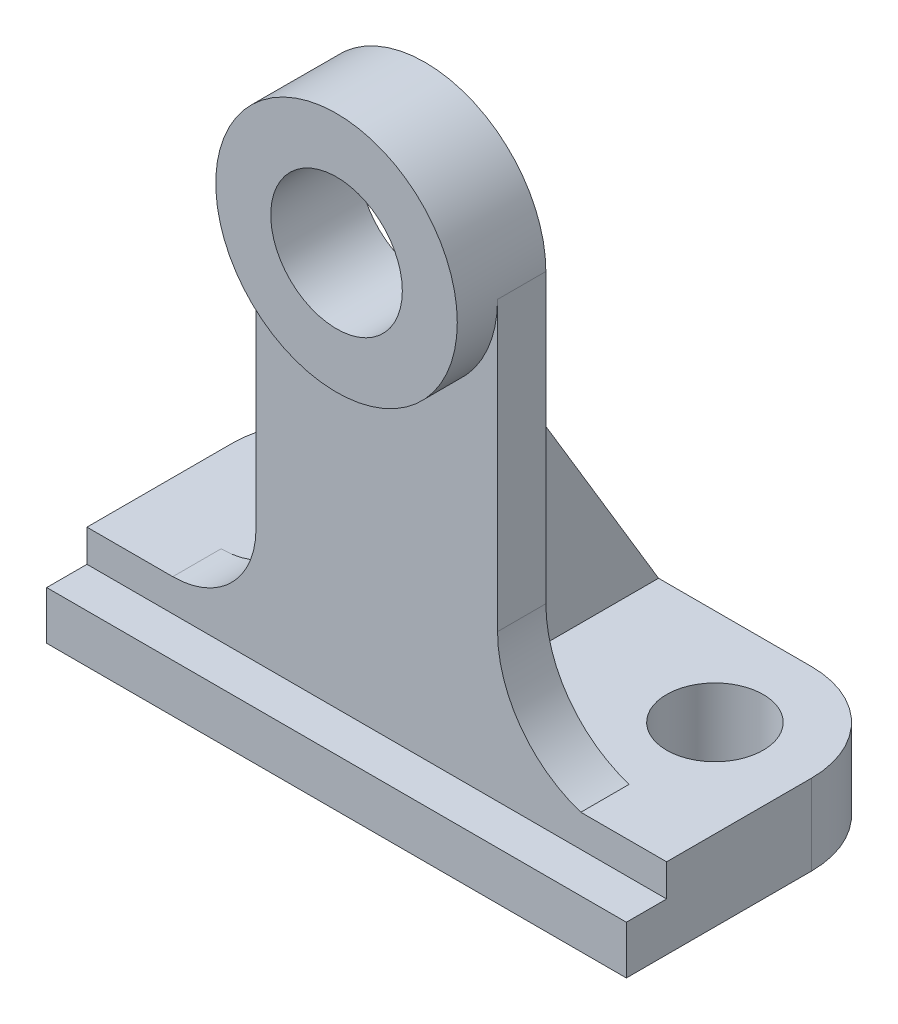
ISO-10303-21;
HEADER;
FILE_DESCRIPTION(('STEP AP214'),'2;1');
FILE_NAME('part.step','',(''),(''),'','','');
FILE_SCHEMA(('AUTOMOTIVE_DESIGN { 1 0 10303 214 1 1 1 1 }'));
ENDSEC;
DATA;
#1=APPLICATION_CONTEXT('core data for automotive mechanical design processes');
#2=APPLICATION_PROTOCOL_DEFINITION('international standard','automotive_design',2000,#1);
#3=PRODUCT_CONTEXT('',#1,'mechanical');
#4=PRODUCT('Part','Part','',(#3));
#5=PRODUCT_RELATED_PRODUCT_CATEGORY('part','',(#4));
#6=PRODUCT_DEFINITION_FORMATION('','',#4);
#7=PRODUCT_DEFINITION_CONTEXT('part definition',#1,'design');
#8=PRODUCT_DEFINITION('design','',#6,#7);
#9=PRODUCT_DEFINITION_SHAPE('','',#8);
#10=(LENGTH_UNIT() NAMED_UNIT(*) SI_UNIT(.MILLI.,.METRE.));
#11=(NAMED_UNIT(*) PLANE_ANGLE_UNIT() SI_UNIT($,.RADIAN.));
#12=(NAMED_UNIT(*) SI_UNIT($,.STERADIAN.) SOLID_ANGLE_UNIT());
#13=UNCERTAINTY_MEASURE_WITH_UNIT(LENGTH_MEASURE(1.E-05),#10,'distance_accuracy_value','');
#14=(GEOMETRIC_REPRESENTATION_CONTEXT(3) GLOBAL_UNCERTAINTY_ASSIGNED_CONTEXT((#13)) GLOBAL_UNIT_ASSIGNED_CONTEXT((#10,
#11,#12)) REPRESENTATION_CONTEXT('',''));
#15=CARTESIAN_POINT('',(0.,0.,0.));
#16=DIRECTION('',(0.,0.,1.));
#17=DIRECTION('',(1.,0.,0.));
#18=AXIS2_PLACEMENT_3D('',#15,#16,#17);
#19=CARTESIAN_POINT('',(72.,10.,12.5));
#20=DIRECTION('',(0.,-1.,0.));
#21=DIRECTION('',(0.,0.,-1.));
#22=AXIS2_PLACEMENT_3D('',#19,#20,#21);
#23=PLANE('',#22);
#24=CARTESIAN_POINT('',(12.,10.,-5.5));
#25=DIRECTION('',(0.,1.,0.));
#26=DIRECTION('',(0.,0.,1.));
#27=AXIS2_PLACEMENT_3D('',#24,#25,#26);
#28=CIRCLE('',#27,6.);
#29=CARTESIAN_POINT('',(12.,10.,0.5));
#30=VERTEX_POINT('',#29);
#31=EDGE_CURVE('E403',#30,#30,#28,.T.);
#32=ORIENTED_EDGE('',*,*,#31,.F.);
#33=EDGE_LOOP('',(#32));
#34=FACE_BOUND('',#33,.T.);
#35=DIRECTION('',(-1.,0.,0.));
#36=VECTOR('',#35,1.);
#37=CARTESIAN_POINT('',(72.,10.,-17.5));
#38=LINE('',#37,#36);
#39=CARTESIAN_POINT('',(31.,9.99999999999999,-17.5));
#40=VERTEX_POINT('',#39);
#41=CARTESIAN_POINT('',(12.,10.,-17.5));
#42=VERTEX_POINT('',#41);
#43=EDGE_CURVE('E321',#40,#42,#38,.T.);
#44=ORIENTED_EDGE('',*,*,#43,.T.);
#45=CARTESIAN_POINT('',(12.,10.,-5.5));
#46=DIRECTION('',(0.,-1.,0.));
#47=DIRECTION('',(0.,0.,-1.));
#48=AXIS2_PLACEMENT_3D('',#45,#46,#47);
#49=CIRCLE('',#48,12.);
#50=CARTESIAN_POINT('',(0.,10.,-5.49999999999999));
#51=VERTEX_POINT('',#50);
#52=EDGE_CURVE('E54',#42,#51,#49,.F.);
#53=ORIENTED_EDGE('',*,*,#52,.T.);
#54=DIRECTION('',(0.,0.,1.));
#55=VECTOR('',#54,1.);
#56=CARTESIAN_POINT('',(0.,10.,12.5));
#57=LINE('',#56,#55);
#58=CARTESIAN_POINT('',(0.,10.,12.5));
#59=VERTEX_POINT('',#58);
#60=EDGE_CURVE('E294',#51,#59,#57,.T.);
#61=ORIENTED_EDGE('',*,*,#60,.T.);
#62=DIRECTION('',(-1.,0.,0.));
#63=VECTOR('',#62,1.);
#64=CARTESIAN_POINT('',(72.,10.,12.5));
#65=LINE('',#64,#63);
#66=CARTESIAN_POINT('',(10.659246626504,10.,12.5));
#67=VERTEX_POINT('',#66);
#68=EDGE_CURVE('E316',#67,#59,#65,.T.);
#69=ORIENTED_EDGE('',*,*,#68,.F.);
#70=DIRECTION('',(0.,0.,1.));
#71=VECTOR('',#70,1.);
#72=CARTESIAN_POINT('',(10.659246626504,10.,6.5));
#73=LINE('',#72,#71);
#74=CARTESIAN_POINT('',(10.659246626504,10.,6.5));
#75=VERTEX_POINT('',#74);
#76=EDGE_CURVE('E257',#75,#67,#73,.T.);
#77=ORIENTED_EDGE('',*,*,#76,.F.);
#78=DIRECTION('',(1.,0.,0.));
#79=VECTOR('',#78,1.);
#80=CARTESIAN_POINT('',(10.659246626504,10.,6.5));
#81=LINE('',#80,#79);
#82=CARTESIAN_POINT('',(31.,10.,6.5));
#83=VERTEX_POINT('',#82);
#84=EDGE_CURVE('E228',#75,#83,#81,.T.);
#85=ORIENTED_EDGE('',*,*,#84,.T.);
#86=DIRECTION('',(0.,0.,1.));
#87=VECTOR('',#86,1.);
#88=CARTESIAN_POINT('',(31.,10.,12.5));
#89=LINE('',#88,#87);
#90=EDGE_CURVE('E168',#40,#83,#89,.T.);
#91=ORIENTED_EDGE('',*,*,#90,.F.);
#92=EDGE_LOOP('',(#44,#53,#61,#69,#77,#85,#91));
#93=FACE_BOUND('',#92,.T.);
#94=ADVANCED_FACE('F45',(#34,#93),#23,.F.);
#95=CARTESIAN_POINT('',(72.,6.,12.5));
#96=DIRECTION('',(0.,0.,-1.));
#97=DIRECTION('',(-1.,0.,0.));
#98=AXIS2_PLACEMENT_3D('',#95,#96,#97);
#99=PLANE('',#98);
#100=DIRECTION('',(0.,-1.,0.));
#101=VECTOR('',#100,1.);
#102=CARTESIAN_POINT('',(51.,60.,12.5));
#103=LINE('',#102,#101);
#104=CARTESIAN_POINT('',(51.,60.,12.5));
#105=VERTEX_POINT('',#104);
#106=CARTESIAN_POINT('',(51.,24.2580300488325,12.5));
#107=VERTEX_POINT('',#106);
#108=EDGE_CURVE('E214',#105,#107,#103,.T.);
#109=ORIENTED_EDGE('',*,*,#108,.F.);
#110=CARTESIAN_POINT('',(36.,60.,12.5));
#111=DIRECTION('',(0.,0.,1.));
#112=DIRECTION('',(1.,0.,0.));
#113=AXIS2_PLACEMENT_3D('',#110,#111,#112);
#114=CIRCLE('',#113,15.);
#115=CARTESIAN_POINT('',(21.,60.,12.5));
#116=VERTEX_POINT('',#115);
#117=EDGE_CURVE('E203',#116,#105,#114,.T.);
#118=ORIENTED_EDGE('',*,*,#117,.F.);
#119=DIRECTION('',(0.,-1.,0.));
#120=VECTOR('',#119,1.);
#121=CARTESIAN_POINT('',(21.,60.,12.5));
#122=LINE('',#121,#120);
#123=CARTESIAN_POINT('',(21.,20.340753373496,12.5));
#124=VERTEX_POINT('',#123);
#125=EDGE_CURVE('E220',#116,#124,#122,.T.);
#126=ORIENTED_EDGE('',*,*,#125,.T.);
#127=CARTESIAN_POINT('',(10.659246626504,20.340753373496,12.5));
#128=DIRECTION('',(0.,0.,-1.));
#129=DIRECTION('',(-1.,0.,0.));
#130=AXIS2_PLACEMENT_3D('',#127,#128,#129);
#131=CIRCLE('',#130,10.340753373496);
#132=EDGE_CURVE('E245',#124,#67,#131,.T.);
#133=ORIENTED_EDGE('',*,*,#132,.T.);
#134=ORIENTED_EDGE('',*,*,#68,.T.);
#135=DIRECTION('',(0.,-1.,0.));
#136=VECTOR('',#135,1.);
#137=CARTESIAN_POINT('',(0.,6.,12.5));
#138=LINE('',#137,#136);
#139=CARTESIAN_POINT('',(0.,6.,12.5));
#140=VERTEX_POINT('',#139);
#141=EDGE_CURVE('E297',#59,#140,#138,.T.);
#142=ORIENTED_EDGE('',*,*,#141,.T.);
#143=DIRECTION('',(-1.,0.,0.));
#144=VECTOR('',#143,1.);
#145=CARTESIAN_POINT('',(72.,6.,12.5));
#146=LINE('',#145,#144);
#147=CARTESIAN_POINT('',(72.,6.,12.5));
#148=VERTEX_POINT('',#147);
#149=EDGE_CURVE('E313',#148,#140,#146,.T.);
#150=ORIENTED_EDGE('',*,*,#149,.F.);
#151=DIRECTION('',(0.,-1.,0.));
#152=VECTOR('',#151,1.);
#153=CARTESIAN_POINT('',(72.,6.,12.5));
#154=LINE('',#153,#152);
#155=CARTESIAN_POINT('',(72.,10.,12.5));
#156=VERTEX_POINT('',#155);
#157=EDGE_CURVE('E282',#156,#148,#154,.T.);
#158=ORIENTED_EDGE('',*,*,#157,.F.);
#159=CARTESIAN_POINT('',(61.340753373496,10.,12.5));
#160=VERTEX_POINT('',#159);
#161=EDGE_CURVE('E317',#156,#160,#65,.T.);
#162=ORIENTED_EDGE('',*,*,#161,.T.);
#163=CARTESIAN_POINT('',(66.,24.2580300488325,12.5));
#164=DIRECTION('',(0.,0.,1.));
#165=DIRECTION('',(1.,0.,0.));
#166=AXIS2_PLACEMENT_3D('',#163,#164,#165);
#167=CIRCLE('',#166,15.);
#168=EDGE_CURVE('E242',#107,#160,#167,.T.);
#169=ORIENTED_EDGE('',*,*,#168,.F.);
#170=EDGE_LOOP('',(#109,#118,#126,#133,#134,#142,#150,#158,#162,#169));
#171=FACE_BOUND('',#170,.T.);
#172=ADVANCED_FACE('F367',(#171),#99,.F.);
#173=CARTESIAN_POINT('',(60.,10.,-5.5));
#174=DIRECTION('',(0.,1.,0.));
#175=DIRECTION('',(0.,0.,1.));
#176=AXIS2_PLACEMENT_3D('',#173,#174,#175);
#177=CIRCLE('',#176,6.);
#178=CARTESIAN_POINT('',(60.,10.,0.500000000000005));
#179=VERTEX_POINT('',#178);
#180=EDGE_CURVE('E399',#179,#179,#177,.T.);
#181=ORIENTED_EDGE('',*,*,#180,.F.);
#182=EDGE_LOOP('',(#181));
#183=FACE_BOUND('',#182,.T.);
#184=DIRECTION('',(0.,0.,1.));
#185=VECTOR('',#184,1.);
#186=CARTESIAN_POINT('',(72.,10.,12.5));
#187=LINE('',#186,#185);
#188=CARTESIAN_POINT('',(72.,10.,-5.49999999999999));
#189=VERTEX_POINT('',#188);
#190=EDGE_CURVE('E278',#189,#156,#187,.T.);
#191=ORIENTED_EDGE('',*,*,#190,.F.);
#192=CARTESIAN_POINT('',(60.,10.,-5.5));
#193=DIRECTION('',(0.,-1.,0.));
#194=DIRECTION('',(0.,0.,-1.));
#195=AXIS2_PLACEMENT_3D('',#192,#193,#194);
#196=CIRCLE('',#195,12.);
#197=CARTESIAN_POINT('',(60.,10.,-17.5));
#198=VERTEX_POINT('',#197);
#199=EDGE_CURVE('E333',#189,#198,#196,.F.);
#200=ORIENTED_EDGE('',*,*,#199,.T.);
#201=CARTESIAN_POINT('',(41.,9.99999999999999,-17.5));
#202=VERTEX_POINT('',#201);
#203=EDGE_CURVE('E322',#198,#202,#38,.T.);
#204=ORIENTED_EDGE('',*,*,#203,.T.);
#205=DIRECTION('',(0.,0.,1.));
#206=VECTOR('',#205,1.);
#207=CARTESIAN_POINT('',(41.,10.,12.5));
#208=LINE('',#207,#206);
#209=CARTESIAN_POINT('',(41.,10.,6.5));
#210=VERTEX_POINT('',#209);
#211=EDGE_CURVE('E173',#202,#210,#208,.T.);
#212=ORIENTED_EDGE('',*,*,#211,.T.);
#213=CARTESIAN_POINT('',(61.340753373496,10.,6.5));
#214=VERTEX_POINT('',#213);
#215=EDGE_CURVE('E227',#210,#214,#81,.T.);
#216=ORIENTED_EDGE('',*,*,#215,.T.);
#217=DIRECTION('',(0.,0.,1.));
#218=VECTOR('',#217,1.);
#219=CARTESIAN_POINT('',(61.340753373496,10.,6.5));
#220=LINE('',#219,#218);
#221=EDGE_CURVE('E261',#214,#160,#220,.T.);
#222=ORIENTED_EDGE('',*,*,#221,.T.);
#223=ORIENTED_EDGE('',*,*,#161,.F.);
#224=EDGE_LOOP('',(#191,#200,#204,#212,#216,#222,#223));
#225=FACE_BOUND('',#224,.T.);
#226=ADVANCED_FACE('F356',(#183,#225),#23,.F.);
#227=CARTESIAN_POINT('',(72.,0.,17.5));
#228=DIRECTION('',(0.,1.,0.));
#229=DIRECTION('',(0.,0.,1.));
#230=AXIS2_PLACEMENT_3D('',#227,#228,#229);
#231=PLANE('',#230);
#232=CARTESIAN_POINT('',(12.,0.,-5.5));
#233=DIRECTION('',(0.,1.,0.));
#234=DIRECTION('',(0.,0.,1.));
#235=AXIS2_PLACEMENT_3D('',#232,#233,#234);
#236=CIRCLE('',#235,6.);
#237=CARTESIAN_POINT('',(12.,0.,0.5));
#238=VERTEX_POINT('',#237);
#239=EDGE_CURVE('E184',#238,#238,#236,.T.);
#240=ORIENTED_EDGE('',*,*,#239,.T.);
#241=EDGE_LOOP('',(#240));
#242=FACE_BOUND('',#241,.T.);
#243=CARTESIAN_POINT('',(60.,0.,-5.5));
#244=DIRECTION('',(0.,1.,0.));
#245=DIRECTION('',(0.,0.,1.));
#246=AXIS2_PLACEMENT_3D('',#243,#244,#245);
#247=CIRCLE('',#246,6.);
#248=CARTESIAN_POINT('',(60.,0.,0.500000000000005));
#249=VERTEX_POINT('',#248);
#250=EDGE_CURVE('E395',#249,#249,#247,.T.);
#251=ORIENTED_EDGE('',*,*,#250,.T.);
#252=EDGE_LOOP('',(#251));
#253=FACE_BOUND('',#252,.T.);
#254=DIRECTION('',(-1.,0.,0.));
#255=VECTOR('',#254,1.);
#256=CARTESIAN_POINT('',(72.,0.,-17.5));
#257=LINE('',#256,#255);
#258=CARTESIAN_POINT('',(60.,0.,-17.5));
#259=VERTEX_POINT('',#258);
#260=CARTESIAN_POINT('',(12.,0.,-17.5));
#261=VERTEX_POINT('',#260);
#262=EDGE_CURVE('E325',#259,#261,#257,.T.);
#263=ORIENTED_EDGE('',*,*,#262,.F.);
#264=CARTESIAN_POINT('',(60.,0.,-5.5));
#265=DIRECTION('',(0.,1.,0.));
#266=DIRECTION('',(0.,0.,1.));
#267=AXIS2_PLACEMENT_3D('',#264,#265,#266);
#268=CIRCLE('',#267,12.);
#269=CARTESIAN_POINT('',(72.,0.,-5.5));
#270=VERTEX_POINT('',#269);
#271=EDGE_CURVE('E346',#259,#270,#268,.F.);
#272=ORIENTED_EDGE('',*,*,#271,.T.);
#273=DIRECTION('',(0.,0.,-1.));
#274=VECTOR('',#273,1.);
#275=CARTESIAN_POINT('',(72.,0.,17.5));
#276=LINE('',#275,#274);
#277=CARTESIAN_POINT('',(72.,0.,17.5));
#278=VERTEX_POINT('',#277);
#279=EDGE_CURVE('E274',#278,#270,#276,.T.);
#280=ORIENTED_EDGE('',*,*,#279,.F.);
#281=DIRECTION('',(-1.,0.,0.));
#282=VECTOR('',#281,1.);
#283=CARTESIAN_POINT('',(72.,0.,17.5));
#284=LINE('',#283,#282);
#285=CARTESIAN_POINT('',(0.,0.,17.5));
#286=VERTEX_POINT('',#285);
#287=EDGE_CURVE('E291',#278,#286,#284,.T.);
#288=ORIENTED_EDGE('',*,*,#287,.T.);
#289=DIRECTION('',(0.,0.,-1.));
#290=VECTOR('',#289,1.);
#291=CARTESIAN_POINT('',(0.,0.,17.5));
#292=LINE('',#291,#290);
#293=CARTESIAN_POINT('',(0.,0.,-5.5));
#294=VERTEX_POINT('',#293);
#295=EDGE_CURVE('E273',#286,#294,#292,.T.);
#296=ORIENTED_EDGE('',*,*,#295,.T.);
#297=CARTESIAN_POINT('',(12.,0.,-5.5));
#298=DIRECTION('',(0.,1.,0.));
#299=DIRECTION('',(0.,0.,1.));
#300=AXIS2_PLACEMENT_3D('',#297,#298,#299);
#301=CIRCLE('',#300,12.);
#302=EDGE_CURVE('E343',#294,#261,#301,.F.);
#303=ORIENTED_EDGE('',*,*,#302,.T.);
#304=EDGE_LOOP('',(#263,#272,#280,#288,#296,#303));
#305=FACE_BOUND('',#304,.T.);
#306=ADVANCED_FACE('F384',(#242,#253,#305),#231,.F.);
#307=CARTESIAN_POINT('',(72.,10.,-17.5));
#308=DIRECTION('',(0.,0.,1.));
#309=DIRECTION('',(1.,0.,0.));
#310=AXIS2_PLACEMENT_3D('',#307,#308,#309);
#311=PLANE('',#310);
#312=ORIENTED_EDGE('',*,*,#203,.F.);
#313=DIRECTION('',(0.,1.,0.));
#314=VECTOR('',#313,1.);
#315=CARTESIAN_POINT('',(60.,10.,-17.5));
#316=LINE('',#315,#314);
#317=EDGE_CURVE('E340',#198,#259,#316,.F.);
#318=ORIENTED_EDGE('',*,*,#317,.T.);
#319=ORIENTED_EDGE('',*,*,#262,.T.);
#320=DIRECTION('',(0.,1.,0.));
#321=VECTOR('',#320,1.);
#322=CARTESIAN_POINT('',(12.,10.,-17.5));
#323=LINE('',#322,#321);
#324=EDGE_CURVE('E336',#261,#42,#323,.T.);
#325=ORIENTED_EDGE('',*,*,#324,.T.);
#326=ORIENTED_EDGE('',*,*,#43,.F.);
#327=DIRECTION('',(1.,0.,0.));
#328=VECTOR('',#327,1.);
#329=CARTESIAN_POINT('',(72.,10.,-17.5));
#330=LINE('',#329,#328);
#331=EDGE_CURVE('E181',#202,#40,#330,.F.);
#332=ORIENTED_EDGE('',*,*,#331,.F.);
#333=EDGE_LOOP('',(#312,#318,#319,#325,#326,#332));
#334=FACE_BOUND('',#333,.T.);
#335=ADVANCED_FACE('F381',(#334),#311,.F.);
#336=CARTESIAN_POINT('',(72.,6.,17.5));
#337=DIRECTION('',(0.,-1.,0.));
#338=DIRECTION('',(0.,0.,-1.));
#339=AXIS2_PLACEMENT_3D('',#336,#337,#338);
#340=PLANE('',#339);
#341=ORIENTED_EDGE('',*,*,#149,.T.);
#342=DIRECTION('',(0.,0.,1.));
#343=VECTOR('',#342,1.);
#344=CARTESIAN_POINT('',(0.,6.,17.5));
#345=LINE('',#344,#343);
#346=CARTESIAN_POINT('',(0.,6.,17.5));
#347=VERTEX_POINT('',#346);
#348=EDGE_CURVE('E301',#140,#347,#345,.T.);
#349=ORIENTED_EDGE('',*,*,#348,.T.);
#350=DIRECTION('',(-1.,0.,0.));
#351=VECTOR('',#350,1.);
#352=CARTESIAN_POINT('',(72.,6.,17.5));
#353=LINE('',#352,#351);
#354=CARTESIAN_POINT('',(72.,6.,17.5));
#355=VERTEX_POINT('',#354);
#356=EDGE_CURVE('E310',#355,#347,#353,.T.);
#357=ORIENTED_EDGE('',*,*,#356,.F.);
#358=DIRECTION('',(0.,0.,1.));
#359=VECTOR('',#358,1.);
#360=CARTESIAN_POINT('',(72.,6.,17.5));
#361=LINE('',#360,#359);
#362=EDGE_CURVE('E285',#148,#355,#361,.T.);
#363=ORIENTED_EDGE('',*,*,#362,.F.);
#364=EDGE_LOOP('',(#341,#349,#357,#363));
#365=FACE_BOUND('',#364,.T.);
#366=ADVANCED_FACE('F486',(#365),#340,.F.);
#367=CARTESIAN_POINT('',(72.,0.,17.5));
#368=DIRECTION('',(0.,0.,-1.));
#369=DIRECTION('',(-1.,0.,0.));
#370=AXIS2_PLACEMENT_3D('',#367,#368,#369);
#371=PLANE('',#370);
#372=ORIENTED_EDGE('',*,*,#356,.T.);
#373=DIRECTION('',(0.,-1.,0.));
#374=VECTOR('',#373,1.);
#375=CARTESIAN_POINT('',(0.,0.,17.5));
#376=LINE('',#375,#374);
#377=EDGE_CURVE('E279',#347,#286,#376,.T.);
#378=ORIENTED_EDGE('',*,*,#377,.T.);
#379=ORIENTED_EDGE('',*,*,#287,.F.);
#380=DIRECTION('',(0.,-1.,0.));
#381=VECTOR('',#380,1.);
#382=CARTESIAN_POINT('',(72.,0.,17.5));
#383=LINE('',#382,#381);
#384=EDGE_CURVE('E288',#355,#278,#383,.T.);
#385=ORIENTED_EDGE('',*,*,#384,.F.);
#386=EDGE_LOOP('',(#372,#378,#379,#385));
#387=FACE_BOUND('',#386,.T.);
#388=ADVANCED_FACE('F481',(#387),#371,.F.);
#389=CARTESIAN_POINT('',(72.,0.,0.));
#390=DIRECTION('',(-1.,0.,0.));
#391=DIRECTION('',(0.,0.,1.));
#392=AXIS2_PLACEMENT_3D('',#389,#390,#391);
#393=PLANE('',#392);
#394=ORIENTED_EDGE('',*,*,#279,.T.);
#395=DIRECTION('',(0.,1.,0.));
#396=VECTOR('',#395,1.);
#397=CARTESIAN_POINT('',(72.,0.,-5.5));
#398=LINE('',#397,#396);
#399=EDGE_CURVE('E329',#270,#189,#398,.T.);
#400=ORIENTED_EDGE('',*,*,#399,.T.);
#401=ORIENTED_EDGE('',*,*,#190,.T.);
#402=ORIENTED_EDGE('',*,*,#157,.T.);
#403=ORIENTED_EDGE('',*,*,#362,.T.);
#404=ORIENTED_EDGE('',*,*,#384,.T.);
#405=EDGE_LOOP('',(#394,#400,#401,#402,#403,#404));
#406=FACE_BOUND('',#405,.T.);
#407=ADVANCED_FACE('F372',(#406),#393,.F.);
#408=CARTESIAN_POINT('',(0.,0.,0.));
#409=DIRECTION('',(-1.,0.,0.));
#410=DIRECTION('',(0.,0.,1.));
#411=AXIS2_PLACEMENT_3D('',#408,#409,#410);
#412=PLANE('',#411);
#413=ORIENTED_EDGE('',*,*,#60,.F.);
#414=DIRECTION('',(0.,1.,0.));
#415=VECTOR('',#414,1.);
#416=CARTESIAN_POINT('',(0.,0.,-5.5));
#417=LINE('',#416,#415);
#418=EDGE_CURVE('E11',#51,#294,#417,.F.);
#419=ORIENTED_EDGE('',*,*,#418,.T.);
#420=ORIENTED_EDGE('',*,*,#295,.F.);
#421=ORIENTED_EDGE('',*,*,#377,.F.);
#422=ORIENTED_EDGE('',*,*,#348,.F.);
#423=ORIENTED_EDGE('',*,*,#141,.F.);
#424=EDGE_LOOP('',(#413,#419,#420,#421,#422,#423));
#425=FACE_BOUND('',#424,.T.);
#426=ADVANCED_FACE('F477',(#425),#412,.T.);
#427=CARTESIAN_POINT('',(36.,60.,6.5));
#428=DIRECTION('',(0.,0.,1.));
#429=DIRECTION('',(1.,0.,0.));
#430=AXIS2_PLACEMENT_3D('',#427,#428,#429);
#431=CYLINDRICAL_SURFACE('',#430,15.);
#432=ORIENTED_EDGE('',*,*,#117,.T.);
#433=DIRECTION('',(0.,0.,1.));
#434=VECTOR('',#433,1.);
#435=CARTESIAN_POINT('',(51.,60.,6.5));
#436=LINE('',#435,#434);
#437=CARTESIAN_POINT('',(51.,60.,6.5));
#438=VERTEX_POINT('',#437);
#439=EDGE_CURVE('E269',#438,#105,#436,.T.);
#440=ORIENTED_EDGE('',*,*,#439,.F.);
#441=CARTESIAN_POINT('',(36.,60.,6.5));
#442=DIRECTION('',(0.,0.,-1.));
#443=DIRECTION('',(-1.,0.,0.));
#444=AXIS2_PLACEMENT_3D('',#441,#442,#443);
#445=CIRCLE('',#444,15.);
#446=CARTESIAN_POINT('',(21.,60.,6.5));
#447=VERTEX_POINT('',#446);
#448=EDGE_CURVE('E215',#447,#438,#445,.T.);
#449=ORIENTED_EDGE('',*,*,#448,.F.);
#450=DIRECTION('',(0.,0.,1.));
#451=VECTOR('',#450,1.);
#452=CARTESIAN_POINT('',(21.,60.,6.5));
#453=LINE('',#452,#451);
#454=EDGE_CURVE('E239',#447,#116,#453,.T.);
#455=ORIENTED_EDGE('',*,*,#454,.T.);
#456=EDGE_LOOP('',(#432,#440,#449,#455));
#457=FACE_BOUND('',#456,.T.);
#458=CARTESIAN_POINT('',(36.,60.,17.5));
#459=DIRECTION('',(0.,0.,1.));
#460=DIRECTION('',(1.,0.,0.));
#461=AXIS2_PLACEMENT_3D('',#458,#459,#460);
#462=CIRCLE('',#461,15.);
#463=CARTESIAN_POINT('',(51.,60.,17.5));
#464=VERTEX_POINT('',#463);
#465=EDGE_CURVE('E204',#464,#464,#462,.T.);
#466=ORIENTED_EDGE('',*,*,#465,.F.);
#467=EDGE_LOOP('',(#466));
#468=FACE_BOUND('',#467,.T.);
#469=ADVANCED_FACE('F473',(#457,#468),#431,.T.);
#470=CARTESIAN_POINT('',(51.,60.,6.5));
#471=DIRECTION('',(-1.,0.,0.));
#472=DIRECTION('',(0.,-1.,0.));
#473=AXIS2_PLACEMENT_3D('',#470,#471,#472);
#474=PLANE('',#473);
#475=ORIENTED_EDGE('',*,*,#108,.T.);
#476=DIRECTION('',(0.,0.,1.));
#477=VECTOR('',#476,1.);
#478=CARTESIAN_POINT('',(51.,24.2580300488325,6.5));
#479=LINE('',#478,#477);
#480=CARTESIAN_POINT('',(51.,24.2580300488325,6.5));
#481=VERTEX_POINT('',#480);
#482=EDGE_CURVE('E265',#481,#107,#479,.T.);
#483=ORIENTED_EDGE('',*,*,#482,.F.);
#484=DIRECTION('',(0.,-1.,0.));
#485=VECTOR('',#484,1.);
#486=CARTESIAN_POINT('',(51.,60.,6.5));
#487=LINE('',#486,#485);
#488=EDGE_CURVE('E219',#438,#481,#487,.T.);
#489=ORIENTED_EDGE('',*,*,#488,.F.);
#490=ORIENTED_EDGE('',*,*,#439,.T.);
#491=EDGE_LOOP('',(#475,#483,#489,#490));
#492=FACE_BOUND('',#491,.T.);
#493=ADVANCED_FACE('F470',(#492),#474,.F.);
#494=CARTESIAN_POINT('',(66.,24.2580300488325,6.5));
#495=DIRECTION('',(0.,0.,1.));
#496=DIRECTION('',(1.,0.,0.));
#497=AXIS2_PLACEMENT_3D('',#494,#495,#496);
#498=CYLINDRICAL_SURFACE('',#497,15.);
#499=ORIENTED_EDGE('',*,*,#168,.T.);
#500=ORIENTED_EDGE('',*,*,#221,.F.);
#501=CARTESIAN_POINT('',(66.,24.2580300488325,6.5));
#502=DIRECTION('',(0.,0.,1.));
#503=DIRECTION('',(1.,0.,0.));
#504=AXIS2_PLACEMENT_3D('',#501,#502,#503);
#505=CIRCLE('',#504,15.);
#506=EDGE_CURVE('E223',#481,#214,#505,.T.);
#507=ORIENTED_EDGE('',*,*,#506,.F.);
#508=ORIENTED_EDGE('',*,*,#482,.T.);
#509=EDGE_LOOP('',(#499,#500,#507,#508));
#510=FACE_BOUND('',#509,.T.);
#511=ADVANCED_FACE('F363',(#510),#498,.F.);
#512=CARTESIAN_POINT('',(10.659246626504,20.340753373496,6.5));
#513=DIRECTION('',(0.,0.,1.));
#514=DIRECTION('',(1.,0.,0.));
#515=AXIS2_PLACEMENT_3D('',#512,#513,#514);
#516=CYLINDRICAL_SURFACE('',#515,10.340753373496);
#517=ORIENTED_EDGE('',*,*,#132,.F.);
#518=DIRECTION('',(0.,0.,1.));
#519=VECTOR('',#518,1.);
#520=CARTESIAN_POINT('',(21.,20.340753373496,6.5));
#521=LINE('',#520,#519);
#522=CARTESIAN_POINT('',(21.,20.340753373496,6.5));
#523=VERTEX_POINT('',#522);
#524=EDGE_CURVE('E254',#523,#124,#521,.T.);
#525=ORIENTED_EDGE('',*,*,#524,.F.);
#526=CARTESIAN_POINT('',(10.659246626504,20.340753373496,6.5));
#527=DIRECTION('',(0.,0.,-1.));
#528=DIRECTION('',(-1.,0.,0.));
#529=AXIS2_PLACEMENT_3D('',#526,#527,#528);
#530=CIRCLE('',#529,10.340753373496);
#531=EDGE_CURVE('E231',#523,#75,#530,.T.);
#532=ORIENTED_EDGE('',*,*,#531,.T.);
#533=ORIENTED_EDGE('',*,*,#76,.T.);
#534=EDGE_LOOP('',(#517,#525,#532,#533));
#535=FACE_BOUND('',#534,.T.);
#536=ADVANCED_FACE('F463',(#535),#516,.F.);
#537=CARTESIAN_POINT('',(21.,60.,6.5));
#538=DIRECTION('',(-1.,0.,0.));
#539=DIRECTION('',(0.,-1.,0.));
#540=AXIS2_PLACEMENT_3D('',#537,#538,#539);
#541=PLANE('',#540);
#542=ORIENTED_EDGE('',*,*,#125,.F.);
#543=ORIENTED_EDGE('',*,*,#454,.F.);
#544=DIRECTION('',(0.,-1.,0.));
#545=VECTOR('',#544,1.);
#546=CARTESIAN_POINT('',(21.,60.,6.5));
#547=LINE('',#546,#545);
#548=EDGE_CURVE('E235',#447,#523,#547,.T.);
#549=ORIENTED_EDGE('',*,*,#548,.T.);
#550=ORIENTED_EDGE('',*,*,#524,.T.);
#551=EDGE_LOOP('',(#542,#543,#549,#550));
#552=FACE_BOUND('',#551,.T.);
#553=ADVANCED_FACE('F460',(#552),#541,.T.);
#554=CARTESIAN_POINT('',(36.,60.,6.5));
#555=DIRECTION('',(0.,0.,-1.));
#556=DIRECTION('',(-1.,0.,0.));
#557=AXIS2_PLACEMENT_3D('',#554,#555,#556);
#558=PLANE('',#557);
#559=DIRECTION('',(0.,-1.,0.));
#560=VECTOR('',#559,1.);
#561=CARTESIAN_POINT('',(41.,60.,6.5));
#562=LINE('',#561,#560);
#563=CARTESIAN_POINT('',(41.,50.,6.5));
#564=VERTEX_POINT('',#563);
#565=EDGE_CURVE('E190',#564,#210,#562,.T.);
#566=ORIENTED_EDGE('',*,*,#565,.F.);
#567=DIRECTION('',(-1.,0.,0.));
#568=VECTOR('',#567,1.);
#569=CARTESIAN_POINT('',(36.,50.,6.5));
#570=LINE('',#569,#568);
#571=CARTESIAN_POINT('',(31.,50.,6.5));
#572=VERTEX_POINT('',#571);
#573=EDGE_CURVE('E178',#572,#564,#570,.F.);
#574=ORIENTED_EDGE('',*,*,#573,.F.);
#575=DIRECTION('',(0.,-1.,0.));
#576=VECTOR('',#575,1.);
#577=CARTESIAN_POINT('',(31.,60.,6.5));
#578=LINE('',#577,#576);
#579=EDGE_CURVE('E163',#572,#83,#578,.T.);
#580=ORIENTED_EDGE('',*,*,#579,.T.);
#581=ORIENTED_EDGE('',*,*,#84,.F.);
#582=ORIENTED_EDGE('',*,*,#531,.F.);
#583=ORIENTED_EDGE('',*,*,#548,.F.);
#584=ORIENTED_EDGE('',*,*,#448,.T.);
#585=ORIENTED_EDGE('',*,*,#488,.T.);
#586=ORIENTED_EDGE('',*,*,#506,.T.);
#587=ORIENTED_EDGE('',*,*,#215,.F.);
#588=EDGE_LOOP('',(#566,#574,#580,#581,#582,#583,#584,#585,#586,#587));
#589=FACE_BOUND('',#588,.T.);
#590=CARTESIAN_POINT('',(36.,60.,6.5));
#591=DIRECTION('',(0.,0.,1.));
#592=DIRECTION('',(1.,0.,0.));
#593=AXIS2_PLACEMENT_3D('',#590,#591,#592);
#594=CIRCLE('',#593,8.17320463682156);
#595=CARTESIAN_POINT('',(44.1732046368216,60.,6.5));
#596=VERTEX_POINT('',#595);
#597=EDGE_CURVE('E208',#596,#596,#594,.T.);
#598=ORIENTED_EDGE('',*,*,#597,.T.);
#599=EDGE_LOOP('',(#598));
#600=FACE_BOUND('',#599,.T.);
#601=ADVANCED_FACE('F187',(#589,#600),#558,.T.);
#602=CARTESIAN_POINT('',(36.,60.,6.5));
#603=DIRECTION('',(0.,0.,1.));
#604=DIRECTION('',(1.,0.,0.));
#605=AXIS2_PLACEMENT_3D('',#602,#603,#604);
#606=CYLINDRICAL_SURFACE('',#605,8.17320463682156);
#607=CARTESIAN_POINT('',(36.,60.,17.5));
#608=DIRECTION('',(0.,0.,1.));
#609=DIRECTION('',(1.,0.,0.));
#610=AXIS2_PLACEMENT_3D('',#607,#608,#609);
#611=CIRCLE('',#610,8.17320463682156);
#612=CARTESIAN_POINT('',(44.1732046368216,60.,17.5));
#613=VERTEX_POINT('',#612);
#614=EDGE_CURVE('E195',#613,#613,#611,.T.);
#615=ORIENTED_EDGE('',*,*,#614,.T.);
#616=EDGE_LOOP('',(#615));
#617=FACE_BOUND('',#616,.T.);
#618=ORIENTED_EDGE('',*,*,#597,.F.);
#619=EDGE_LOOP('',(#618));
#620=FACE_BOUND('',#619,.T.);
#621=ADVANCED_FACE('F453',(#617,#620),#606,.F.);
#622=CARTESIAN_POINT('',(36.,60.,17.5));
#623=DIRECTION('',(0.,0.,1.));
#624=DIRECTION('',(1.,0.,0.));
#625=AXIS2_PLACEMENT_3D('',#622,#623,#624);
#626=PLANE('',#625);
#627=ORIENTED_EDGE('',*,*,#614,.F.);
#628=EDGE_LOOP('',(#627));
#629=FACE_BOUND('',#628,.T.);
#630=ORIENTED_EDGE('',*,*,#465,.T.);
#631=EDGE_LOOP('',(#630));
#632=FACE_BOUND('',#631,.T.);
#633=ADVANCED_FACE('F450',(#629,#632),#626,.T.);
#634=CARTESIAN_POINT('',(36.,50.,6.5));
#635=DIRECTION('',(0.,-0.514495755427526,0.857492925712544));
#636=DIRECTION('',(0.,-0.857492925712544,-0.514495755427526));
#637=AXIS2_PLACEMENT_3D('',#634,#635,#636);
#638=PLANE('',#637);
#639=DIRECTION('',(0.,-0.857492925712544,-0.514495755427526));
#640=VECTOR('',#639,1.);
#641=CARTESIAN_POINT('',(41.,50.,6.5));
#642=LINE('',#641,#640);
#643=EDGE_CURVE('E183',#564,#202,#642,.T.);
#644=ORIENTED_EDGE('',*,*,#643,.T.);
#645=ORIENTED_EDGE('',*,*,#331,.T.);
#646=DIRECTION('',(0.,-0.857492925712544,-0.514495755427526));
#647=VECTOR('',#646,1.);
#648=CARTESIAN_POINT('',(31.,50.,6.5));
#649=LINE('',#648,#647);
#650=EDGE_CURVE('E166',#572,#40,#649,.T.);
#651=ORIENTED_EDGE('',*,*,#650,.F.);
#652=ORIENTED_EDGE('',*,*,#573,.T.);
#653=EDGE_LOOP('',(#644,#645,#651,#652));
#654=FACE_BOUND('',#653,.T.);
#655=ADVANCED_FACE('F177',(#654),#638,.F.);
#656=CARTESIAN_POINT('',(41.,37.5,0.));
#657=DIRECTION('',(1.,0.,0.));
#658=DIRECTION('',(0.,0.,-1.));
#659=AXIS2_PLACEMENT_3D('',#656,#657,#658);
#660=PLANE('',#659);
#661=ORIENTED_EDGE('',*,*,#643,.F.);
#662=ORIENTED_EDGE('',*,*,#565,.T.);
#663=ORIENTED_EDGE('',*,*,#211,.F.);
#664=EDGE_LOOP('',(#661,#662,#663));
#665=FACE_BOUND('',#664,.T.);
#666=ADVANCED_FACE('F441',(#665),#660,.T.);
#667=CARTESIAN_POINT('',(31.,37.5,0.));
#668=DIRECTION('',(1.,0.,0.));
#669=DIRECTION('',(0.,0.,-1.));
#670=AXIS2_PLACEMENT_3D('',#667,#668,#669);
#671=PLANE('',#670);
#672=ORIENTED_EDGE('',*,*,#579,.F.);
#673=ORIENTED_EDGE('',*,*,#650,.T.);
#674=ORIENTED_EDGE('',*,*,#90,.T.);
#675=EDGE_LOOP('',(#672,#673,#674));
#676=FACE_BOUND('',#675,.T.);
#677=ADVANCED_FACE('F165',(#676),#671,.F.);
#678=CARTESIAN_POINT('',(60.,0.,-5.5));
#679=DIRECTION('',(0.,1.,0.));
#680=DIRECTION('',(0.,0.,1.));
#681=AXIS2_PLACEMENT_3D('',#678,#679,#680);
#682=CYLINDRICAL_SURFACE('',#681,6.);
#683=ORIENTED_EDGE('',*,*,#250,.F.);
#684=EDGE_LOOP('',(#683));
#685=FACE_BOUND('',#684,.T.);
#686=ORIENTED_EDGE('',*,*,#180,.T.);
#687=EDGE_LOOP('',(#686));
#688=FACE_BOUND('',#687,.T.);
#689=ADVANCED_FACE('F416',(#685,#688),#682,.F.);
#690=CARTESIAN_POINT('',(12.,0.,-5.5));
#691=DIRECTION('',(0.,1.,0.));
#692=DIRECTION('',(0.,0.,1.));
#693=AXIS2_PLACEMENT_3D('',#690,#691,#692);
#694=CYLINDRICAL_SURFACE('',#693,6.);
#695=ORIENTED_EDGE('',*,*,#239,.F.);
#696=EDGE_LOOP('',(#695));
#697=FACE_BOUND('',#696,.T.);
#698=ORIENTED_EDGE('',*,*,#31,.T.);
#699=EDGE_LOOP('',(#698));
#700=FACE_BOUND('',#699,.T.);
#701=ADVANCED_FACE('F413',(#697,#700),#694,.F.);
#702=CARTESIAN_POINT('',(60.,0.,-5.5));
#703=DIRECTION('',(0.,1.,0.));
#704=DIRECTION('',(0.,0.,1.));
#705=AXIS2_PLACEMENT_3D('',#702,#703,#704);
#706=CYLINDRICAL_SURFACE('',#705,12.);
#707=ORIENTED_EDGE('',*,*,#271,.F.);
#708=ORIENTED_EDGE('',*,*,#317,.F.);
#709=ORIENTED_EDGE('',*,*,#199,.F.);
#710=ORIENTED_EDGE('',*,*,#399,.F.);
#711=EDGE_LOOP('',(#707,#708,#709,#710));
#712=FACE_BOUND('',#711,.T.);
#713=ADVANCED_FACE('F377',(#712),#706,.T.);
#714=CARTESIAN_POINT('',(12.,10.,-5.5));
#715=DIRECTION('',(0.,-1.,0.));
#716=DIRECTION('',(0.,0.,-1.));
#717=AXIS2_PLACEMENT_3D('',#714,#715,#716);
#718=CYLINDRICAL_SURFACE('',#717,12.);
#719=ORIENTED_EDGE('',*,*,#302,.F.);
#720=ORIENTED_EDGE('',*,*,#418,.F.);
#721=ORIENTED_EDGE('',*,*,#52,.F.);
#722=ORIENTED_EDGE('',*,*,#324,.F.);
#723=EDGE_LOOP('',(#719,#720,#721,#722));
#724=FACE_BOUND('',#723,.T.);
#725=ADVANCED_FACE('F47',(#724),#718,.T.);
#726=CLOSED_SHELL('',(#94,#172,#226,#306,#335,#366,#388,#407,#426,#469,#493,#511,#536,#553,#601,
#621,#633,#655,#666,#677,#689,#701,#713,#725));
#727=MANIFOLD_SOLID_BREP('B2',#726);
#728=ADVANCED_BREP_SHAPE_REPRESENTATION('',(#18,#727),#14);
#729=SHAPE_DEFINITION_REPRESENTATION(#9,#728);
ENDSEC;
END-ISO-10303-21;
